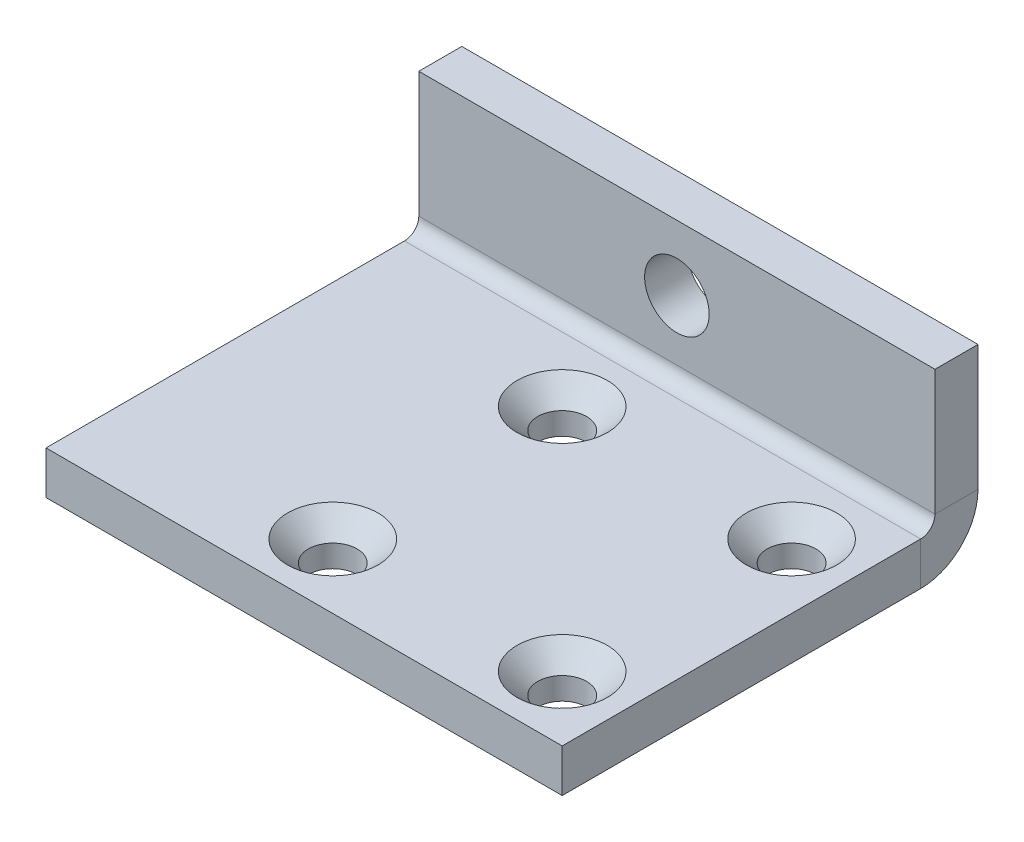
ISO-10303-21;
HEADER;
FILE_DESCRIPTION(('STEP AP214'),'2;1');
FILE_NAME('part.step','',(''),(''),'','','');
FILE_SCHEMA(('AUTOMOTIVE_DESIGN { 1 0 10303 214 1 1 1 1 }'));
ENDSEC;
DATA;
#1=APPLICATION_CONTEXT('core data for automotive mechanical design processes');
#2=APPLICATION_PROTOCOL_DEFINITION('international standard','automotive_design',2000,#1);
#3=PRODUCT_CONTEXT('',#1,'mechanical');
#4=PRODUCT('Part','Part','',(#3));
#5=PRODUCT_RELATED_PRODUCT_CATEGORY('part','',(#4));
#6=PRODUCT_DEFINITION_FORMATION('','',#4);
#7=PRODUCT_DEFINITION_CONTEXT('part definition',#1,'design');
#8=PRODUCT_DEFINITION('design','',#6,#7);
#9=PRODUCT_DEFINITION_SHAPE('','',#8);
#10=(LENGTH_UNIT() NAMED_UNIT(*) SI_UNIT(.MILLI.,.METRE.));
#11=(NAMED_UNIT(*) PLANE_ANGLE_UNIT() SI_UNIT($,.RADIAN.));
#12=(NAMED_UNIT(*) SI_UNIT($,.STERADIAN.) SOLID_ANGLE_UNIT());
#13=UNCERTAINTY_MEASURE_WITH_UNIT(LENGTH_MEASURE(1.E-05),#10,'distance_accuracy_value','');
#14=(GEOMETRIC_REPRESENTATION_CONTEXT(3) GLOBAL_UNCERTAINTY_ASSIGNED_CONTEXT((#13)) GLOBAL_UNIT_ASSIGNED_CONTEXT((#10,
#11,#12)) REPRESENTATION_CONTEXT('',''));
#15=CARTESIAN_POINT('',(0.,0.,0.));
#16=DIRECTION('',(0.,0.,1.));
#17=DIRECTION('',(1.,0.,0.));
#18=AXIS2_PLACEMENT_3D('',#15,#16,#17);
#19=CARTESIAN_POINT('',(36.,0.,3.99999999999999));
#20=DIRECTION('',(1.,0.,0.));
#21=DIRECTION('',(0.,0.,-1.));
#22=AXIS2_PLACEMENT_3D('',#19,#20,#21);
#23=PLANE('',#22);
#24=DIRECTION('',(0.,1.,0.));
#25=VECTOR('',#24,1.);
#26=CARTESIAN_POINT('',(36.,0.,3.99999999999999));
#27=LINE('',#26,#25);
#28=CARTESIAN_POINT('',(36.,0.,3.99999999999999));
#29=VERTEX_POINT('',#28);
#30=CARTESIAN_POINT('',(36.,3.,4.));
#31=VERTEX_POINT('',#30);
#32=EDGE_CURVE('E11',#29,#31,#27,.T.);
#33=ORIENTED_EDGE('',*,*,#32,.F.);
#34=CARTESIAN_POINT('',(36.,4.,4.));
#35=DIRECTION('',(-1.,0.,0.));
#36=DIRECTION('',(0.,0.,1.));
#37=AXIS2_PLACEMENT_3D('',#34,#35,#36);
#38=CIRCLE('',#37,4.);
#39=CARTESIAN_POINT('',(36.,4.,0.));
#40=VERTEX_POINT('',#39);
#41=EDGE_CURVE('E128',#29,#40,#38,.F.);
#42=ORIENTED_EDGE('',*,*,#41,.T.);
#43=DIRECTION('',(0.,0.,-1.));
#44=VECTOR('',#43,1.);
#45=CARTESIAN_POINT('',(36.,4.,3.));
#46=LINE('',#45,#44);
#47=CARTESIAN_POINT('',(36.,4.,3.));
#48=VERTEX_POINT('',#47);
#49=EDGE_CURVE('E46',#48,#40,#46,.T.);
#50=ORIENTED_EDGE('',*,*,#49,.F.);
#51=CARTESIAN_POINT('',(36.,4.,4.));
#52=DIRECTION('',(1.,0.,0.));
#53=DIRECTION('',(0.,0.,-1.));
#54=AXIS2_PLACEMENT_3D('',#51,#52,#53);
#55=CIRCLE('',#54,1.);
#56=EDGE_CURVE('E135',#31,#48,#55,.T.);
#57=ORIENTED_EDGE('',*,*,#56,.F.);
#58=EDGE_LOOP('',(#33,#42,#50,#57));
#59=FACE_BOUND('',#58,.T.);
#60=ADVANCED_FACE('F38',(#59),#23,.T.);
#61=CARTESIAN_POINT('',(36.,4.,3.));
#62=DIRECTION('',(1.,0.,0.));
#63=DIRECTION('',(0.,0.,-1.));
#64=AXIS2_PLACEMENT_3D('',#61,#62,#63);
#65=PLANE('',#64);
#66=DIRECTION('',(0.,0.,-1.));
#67=VECTOR('',#66,1.);
#68=CARTESIAN_POINT('',(36.,0.,0.));
#69=LINE('',#68,#67);
#70=CARTESIAN_POINT('',(36.,0.,29.));
#71=VERTEX_POINT('',#70);
#72=EDGE_CURVE('E123',#71,#29,#69,.T.);
#73=ORIENTED_EDGE('',*,*,#72,.T.);
#74=ORIENTED_EDGE('',*,*,#32,.T.);
#75=DIRECTION('',(0.,0.,-1.));
#76=VECTOR('',#75,1.);
#77=CARTESIAN_POINT('',(36.,3.,0.));
#78=LINE('',#77,#76);
#79=CARTESIAN_POINT('',(36.,3.,29.));
#80=VERTEX_POINT('',#79);
#81=EDGE_CURVE('E133',#80,#31,#78,.T.);
#82=ORIENTED_EDGE('',*,*,#81,.F.);
#83=DIRECTION('',(0.,1.,0.));
#84=VECTOR('',#83,1.);
#85=CARTESIAN_POINT('',(36.,0.,29.));
#86=LINE('',#85,#84);
#87=EDGE_CURVE('E114',#71,#80,#86,.T.);
#88=ORIENTED_EDGE('',*,*,#87,.F.);
#89=EDGE_LOOP('',(#73,#74,#82,#88));
#90=FACE_BOUND('',#89,.T.);
#91=ADVANCED_FACE('F131',(#90),#65,.T.);
#92=CARTESIAN_POINT('',(0.,4.,0.));
#93=DIRECTION('',(-1.,0.,0.));
#94=DIRECTION('',(0.,0.,1.));
#95=AXIS2_PLACEMENT_3D('',#92,#93,#94);
#96=PLANE('',#95);
#97=DIRECTION('',(0.,0.,1.));
#98=VECTOR('',#97,1.);
#99=CARTESIAN_POINT('',(0.,4.,0.));
#100=LINE('',#99,#98);
#101=CARTESIAN_POINT('',(0.,4.,0.));
#102=VERTEX_POINT('',#101);
#103=CARTESIAN_POINT('',(0.,4.,3.));
#104=VERTEX_POINT('',#103);
#105=EDGE_CURVE('E89',#102,#104,#100,.T.);
#106=ORIENTED_EDGE('',*,*,#105,.F.);
#107=CARTESIAN_POINT('',(0.,4.,4.));
#108=DIRECTION('',(-1.,0.,0.));
#109=DIRECTION('',(0.,0.,1.));
#110=AXIS2_PLACEMENT_3D('',#107,#108,#109);
#111=CIRCLE('',#110,4.);
#112=CARTESIAN_POINT('',(0.,0.,3.99999999999999));
#113=VERTEX_POINT('',#112);
#114=EDGE_CURVE('E158',#113,#102,#111,.F.);
#115=ORIENTED_EDGE('',*,*,#114,.F.);
#116=DIRECTION('',(0.,-1.,0.));
#117=VECTOR('',#116,1.);
#118=CARTESIAN_POINT('',(0.,3.,4.));
#119=LINE('',#118,#117);
#120=CARTESIAN_POINT('',(0.,3.,4.));
#121=VERTEX_POINT('',#120);
#122=EDGE_CURVE('E82',#121,#113,#119,.T.);
#123=ORIENTED_EDGE('',*,*,#122,.F.);
#124=CARTESIAN_POINT('',(0.,4.,4.));
#125=DIRECTION('',(1.,0.,0.));
#126=DIRECTION('',(0.,0.,-1.));
#127=AXIS2_PLACEMENT_3D('',#124,#125,#126);
#128=CIRCLE('',#127,1.);
#129=EDGE_CURVE('E151',#121,#104,#128,.T.);
#130=ORIENTED_EDGE('',*,*,#129,.T.);
#131=EDGE_LOOP('',(#106,#115,#123,#130));
#132=FACE_BOUND('',#131,.T.);
#133=ADVANCED_FACE('F190',(#132),#96,.T.);
#134=CARTESIAN_POINT('',(0.,3.,4.));
#135=DIRECTION('',(-1.,0.,0.));
#136=DIRECTION('',(0.,0.,1.));
#137=AXIS2_PLACEMENT_3D('',#134,#135,#136);
#138=PLANE('',#137);
#139=DIRECTION('',(0.,1.,0.));
#140=VECTOR('',#139,1.);
#141=CARTESIAN_POINT('',(0.,0.,0.));
#142=LINE('',#141,#140);
#143=CARTESIAN_POINT('',(0.,12.75,0.));
#144=VERTEX_POINT('',#143);
#145=EDGE_CURVE('E141',#102,#144,#142,.T.);
#146=ORIENTED_EDGE('',*,*,#145,.F.);
#147=ORIENTED_EDGE('',*,*,#105,.T.);
#148=DIRECTION('',(0.,1.,0.));
#149=VECTOR('',#148,1.);
#150=CARTESIAN_POINT('',(0.,0.,3.));
#151=LINE('',#150,#149);
#152=CARTESIAN_POINT('',(0.,12.75,3.));
#153=VERTEX_POINT('',#152);
#154=EDGE_CURVE('E148',#104,#153,#151,.T.);
#155=ORIENTED_EDGE('',*,*,#154,.T.);
#156=DIRECTION('',(0.,0.,-1.));
#157=VECTOR('',#156,1.);
#158=CARTESIAN_POINT('',(0.,12.75,3.));
#159=LINE('',#158,#157);
#160=EDGE_CURVE('E144',#153,#144,#159,.T.);
#161=ORIENTED_EDGE('',*,*,#160,.T.);
#162=EDGE_LOOP('',(#146,#147,#155,#161));
#163=FACE_BOUND('',#162,.T.);
#164=ADVANCED_FACE('F177',(#163),#138,.T.);
#165=CARTESIAN_POINT('',(36.,0.,0.));
#166=DIRECTION('',(0.,0.,1.));
#167=DIRECTION('',(1.,0.,0.));
#168=AXIS2_PLACEMENT_3D('',#165,#166,#167);
#169=PLANE('',#168);
#170=CARTESIAN_POINT('',(18.,8.2,0.));
#171=DIRECTION('',(0.,0.,1.));
#172=DIRECTION('',(1.,0.,0.));
#173=AXIS2_PLACEMENT_3D('',#170,#171,#172);
#174=CIRCLE('',#173,2.25);
#175=CARTESIAN_POINT('',(20.25,8.2,0.));
#176=VERTEX_POINT('',#175);
#177=EDGE_CURVE('E237',#176,#176,#174,.T.);
#178=ORIENTED_EDGE('',*,*,#177,.T.);
#179=EDGE_LOOP('',(#178));
#180=FACE_BOUND('',#179,.T.);
#181=ORIENTED_EDGE('',*,*,#145,.T.);
#182=DIRECTION('',(-1.,0.,0.));
#183=VECTOR('',#182,1.);
#184=CARTESIAN_POINT('',(36.,12.75,0.));
#185=LINE('',#184,#183);
#186=CARTESIAN_POINT('',(36.,12.75,0.));
#187=VERTEX_POINT('',#186);
#188=EDGE_CURVE('E172',#187,#144,#185,.T.);
#189=ORIENTED_EDGE('',*,*,#188,.F.);
#190=DIRECTION('',(0.,1.,0.));
#191=VECTOR('',#190,1.);
#192=CARTESIAN_POINT('',(36.,0.,0.));
#193=LINE('',#192,#191);
#194=EDGE_CURVE('E95',#40,#187,#193,.T.);
#195=ORIENTED_EDGE('',*,*,#194,.F.);
#196=DIRECTION('',(-1.,0.,0.));
#197=VECTOR('',#196,1.);
#198=CARTESIAN_POINT('',(36.,4.,0.));
#199=LINE('',#198,#197);
#200=EDGE_CURVE('E140',#40,#102,#199,.T.);
#201=ORIENTED_EDGE('',*,*,#200,.T.);
#202=EDGE_LOOP('',(#181,#189,#195,#201));
#203=FACE_BOUND('',#202,.T.);
#204=ADVANCED_FACE('F254',(#180,#203),#169,.F.);
#205=CARTESIAN_POINT('',(36.,12.75,3.));
#206=DIRECTION('',(0.,1.,0.));
#207=DIRECTION('',(0.,0.,1.));
#208=AXIS2_PLACEMENT_3D('',#205,#206,#207);
#209=PLANE('',#208);
#210=ORIENTED_EDGE('',*,*,#160,.F.);
#211=DIRECTION('',(-1.,0.,0.));
#212=VECTOR('',#211,1.);
#213=CARTESIAN_POINT('',(36.,12.75,3.));
#214=LINE('',#213,#212);
#215=CARTESIAN_POINT('',(36.,12.75,3.));
#216=VERTEX_POINT('',#215);
#217=EDGE_CURVE('E170',#216,#153,#214,.T.);
#218=ORIENTED_EDGE('',*,*,#217,.F.);
#219=DIRECTION('',(0.,0.,-1.));
#220=VECTOR('',#219,1.);
#221=CARTESIAN_POINT('',(36.,12.75,3.));
#222=LINE('',#221,#220);
#223=EDGE_CURVE('E196',#216,#187,#222,.T.);
#224=ORIENTED_EDGE('',*,*,#223,.T.);
#225=ORIENTED_EDGE('',*,*,#188,.T.);
#226=EDGE_LOOP('',(#210,#218,#224,#225));
#227=FACE_BOUND('',#226,.T.);
#228=ADVANCED_FACE('F247',(#227),#209,.T.);
#229=CARTESIAN_POINT('',(36.,0.,3.));
#230=DIRECTION('',(0.,0.,1.));
#231=DIRECTION('',(1.,0.,0.));
#232=AXIS2_PLACEMENT_3D('',#229,#230,#231);
#233=PLANE('',#232);
#234=CARTESIAN_POINT('',(18.,8.2,3.));
#235=DIRECTION('',(0.,0.,1.));
#236=DIRECTION('',(1.,0.,0.));
#237=AXIS2_PLACEMENT_3D('',#234,#235,#236);
#238=CIRCLE('',#237,2.25);
#239=CARTESIAN_POINT('',(20.25,8.2,3.));
#240=VERTEX_POINT('',#239);
#241=EDGE_CURVE('E240',#240,#240,#238,.T.);
#242=ORIENTED_EDGE('',*,*,#241,.F.);
#243=EDGE_LOOP('',(#242));
#244=FACE_BOUND('',#243,.T.);
#245=ORIENTED_EDGE('',*,*,#154,.F.);
#246=DIRECTION('',(-1.,0.,0.));
#247=VECTOR('',#246,1.);
#248=CARTESIAN_POINT('',(36.,4.,3.));
#249=LINE('',#248,#247);
#250=EDGE_CURVE('E167',#48,#104,#249,.T.);
#251=ORIENTED_EDGE('',*,*,#250,.F.);
#252=DIRECTION('',(0.,1.,0.));
#253=VECTOR('',#252,1.);
#254=CARTESIAN_POINT('',(36.,0.,3.));
#255=LINE('',#254,#253);
#256=EDGE_CURVE('E195',#48,#216,#255,.T.);
#257=ORIENTED_EDGE('',*,*,#256,.T.);
#258=ORIENTED_EDGE('',*,*,#217,.T.);
#259=EDGE_LOOP('',(#245,#251,#257,#258));
#260=FACE_BOUND('',#259,.T.);
#261=ADVANCED_FACE('F188',(#244,#260),#233,.T.);
#262=CARTESIAN_POINT('',(36.,4.,4.));
#263=DIRECTION('',(-1.,0.,0.));
#264=DIRECTION('',(0.,0.,1.));
#265=AXIS2_PLACEMENT_3D('',#262,#263,#264);
#266=CYLINDRICAL_SURFACE('',#265,1.);
#267=ORIENTED_EDGE('',*,*,#129,.F.);
#268=DIRECTION('',(-1.,0.,0.));
#269=VECTOR('',#268,1.);
#270=CARTESIAN_POINT('',(36.,3.,4.));
#271=LINE('',#270,#269);
#272=EDGE_CURVE('E164',#31,#121,#271,.T.);
#273=ORIENTED_EDGE('',*,*,#272,.F.);
#274=ORIENTED_EDGE('',*,*,#56,.T.);
#275=ORIENTED_EDGE('',*,*,#250,.T.);
#276=EDGE_LOOP('',(#267,#273,#274,#275));
#277=FACE_BOUND('',#276,.T.);
#278=ADVANCED_FACE('F183',(#277),#266,.F.);
#279=CARTESIAN_POINT('',(36.,3.,0.));
#280=DIRECTION('',(0.,1.,0.));
#281=DIRECTION('',(0.,0.,1.));
#282=AXIS2_PLACEMENT_3D('',#279,#280,#281);
#283=PLANE('',#282);
#284=CARTESIAN_POINT('',(15.5,3.,24.5));
#285=DIRECTION('',(0.,1.,0.));
#286=DIRECTION('',(0.,0.,1.));
#287=AXIS2_PLACEMENT_3D('',#284,#285,#286);
#288=CIRCLE('',#287,3.15);
#289=CARTESIAN_POINT('',(15.5,3.,27.65));
#290=VERTEX_POINT('',#289);
#291=EDGE_CURVE('E234',#290,#290,#288,.T.);
#292=ORIENTED_EDGE('',*,*,#291,.F.);
#293=EDGE_LOOP('',(#292));
#294=FACE_BOUND('',#293,.T.);
#295=CARTESIAN_POINT('',(15.5,3.,8.5));
#296=DIRECTION('',(0.,1.,0.));
#297=DIRECTION('',(0.,0.,1.));
#298=AXIS2_PLACEMENT_3D('',#295,#296,#297);
#299=CIRCLE('',#298,3.15);
#300=CARTESIAN_POINT('',(15.5,3.,11.65));
#301=VERTEX_POINT('',#300);
#302=EDGE_CURVE('E225',#301,#301,#299,.T.);
#303=ORIENTED_EDGE('',*,*,#302,.F.);
#304=EDGE_LOOP('',(#303));
#305=FACE_BOUND('',#304,.T.);
#306=CARTESIAN_POINT('',(31.5,3.,8.5));
#307=DIRECTION('',(0.,1.,0.));
#308=DIRECTION('',(0.,0.,1.));
#309=AXIS2_PLACEMENT_3D('',#306,#307,#308);
#310=CIRCLE('',#309,3.15);
#311=CARTESIAN_POINT('',(31.5,3.,11.65));
#312=VERTEX_POINT('',#311);
#313=EDGE_CURVE('E216',#312,#312,#310,.T.);
#314=ORIENTED_EDGE('',*,*,#313,.F.);
#315=EDGE_LOOP('',(#314));
#316=FACE_BOUND('',#315,.T.);
#317=CARTESIAN_POINT('',(31.5,3.,24.5));
#318=DIRECTION('',(0.,1.,0.));
#319=DIRECTION('',(0.,0.,1.));
#320=AXIS2_PLACEMENT_3D('',#317,#318,#319);
#321=CIRCLE('',#320,3.15);
#322=CARTESIAN_POINT('',(31.5,3.,27.65));
#323=VERTEX_POINT('',#322);
#324=EDGE_CURVE('E207',#323,#323,#321,.T.);
#325=ORIENTED_EDGE('',*,*,#324,.F.);
#326=EDGE_LOOP('',(#325));
#327=FACE_BOUND('',#326,.T.);
#328=DIRECTION('',(0.,0.,-1.));
#329=VECTOR('',#328,1.);
#330=CARTESIAN_POINT('',(0.,3.,0.));
#331=LINE('',#330,#329);
#332=CARTESIAN_POINT('',(0.,3.,29.));
#333=VERTEX_POINT('',#332);
#334=EDGE_CURVE('E153',#333,#121,#331,.T.);
#335=ORIENTED_EDGE('',*,*,#334,.F.);
#336=DIRECTION('',(-1.,0.,0.));
#337=VECTOR('',#336,1.);
#338=CARTESIAN_POINT('',(36.,3.,29.));
#339=LINE('',#338,#337);
#340=EDGE_CURVE('E118',#80,#333,#339,.T.);
#341=ORIENTED_EDGE('',*,*,#340,.F.);
#342=ORIENTED_EDGE('',*,*,#81,.T.);
#343=ORIENTED_EDGE('',*,*,#272,.T.);
#344=EDGE_LOOP('',(#335,#341,#342,#343));
#345=FACE_BOUND('',#344,.T.);
#346=ADVANCED_FACE('F193',(#294,#305,#316,#327,#345),#283,.T.);
#347=CARTESIAN_POINT('',(36.,0.,29.));
#348=DIRECTION('',(0.,0.,1.));
#349=DIRECTION('',(1.,0.,0.));
#350=AXIS2_PLACEMENT_3D('',#347,#348,#349);
#351=PLANE('',#350);
#352=DIRECTION('',(0.,1.,0.));
#353=VECTOR('',#352,1.);
#354=CARTESIAN_POINT('',(0.,0.,29.));
#355=LINE('',#354,#353);
#356=CARTESIAN_POINT('',(0.,0.,29.));
#357=VERTEX_POINT('',#356);
#358=EDGE_CURVE('E116',#357,#333,#355,.T.);
#359=ORIENTED_EDGE('',*,*,#358,.F.);
#360=DIRECTION('',(-1.,0.,0.));
#361=VECTOR('',#360,1.);
#362=CARTESIAN_POINT('',(36.,0.,29.));
#363=LINE('',#362,#361);
#364=EDGE_CURVE('E110',#71,#357,#363,.T.);
#365=ORIENTED_EDGE('',*,*,#364,.F.);
#366=ORIENTED_EDGE('',*,*,#87,.T.);
#367=ORIENTED_EDGE('',*,*,#340,.T.);
#368=EDGE_LOOP('',(#359,#365,#366,#367));
#369=FACE_BOUND('',#368,.T.);
#370=ADVANCED_FACE('F112',(#369),#351,.T.);
#371=CARTESIAN_POINT('',(36.,0.,0.));
#372=DIRECTION('',(0.,1.,0.));
#373=DIRECTION('',(0.,0.,1.));
#374=AXIS2_PLACEMENT_3D('',#371,#372,#373);
#375=PLANE('',#374);
#376=CARTESIAN_POINT('',(15.5,0.,24.5));
#377=DIRECTION('',(0.,1.,0.));
#378=DIRECTION('',(0.,0.,1.));
#379=AXIS2_PLACEMENT_3D('',#376,#377,#378);
#380=CIRCLE('',#379,1.69999999999999);
#381=CARTESIAN_POINT('',(15.5,0.,26.2));
#382=VERTEX_POINT('',#381);
#383=EDGE_CURVE('E228',#382,#382,#380,.T.);
#384=ORIENTED_EDGE('',*,*,#383,.T.);
#385=EDGE_LOOP('',(#384));
#386=FACE_BOUND('',#385,.T.);
#387=CARTESIAN_POINT('',(15.5,0.,8.5));
#388=DIRECTION('',(0.,1.,0.));
#389=DIRECTION('',(0.,0.,1.));
#390=AXIS2_PLACEMENT_3D('',#387,#388,#389);
#391=CIRCLE('',#390,1.69999999999999);
#392=CARTESIAN_POINT('',(15.5,0.,10.2));
#393=VERTEX_POINT('',#392);
#394=EDGE_CURVE('E219',#393,#393,#391,.T.);
#395=ORIENTED_EDGE('',*,*,#394,.T.);
#396=EDGE_LOOP('',(#395));
#397=FACE_BOUND('',#396,.T.);
#398=CARTESIAN_POINT('',(31.5,0.,8.5));
#399=DIRECTION('',(0.,1.,0.));
#400=DIRECTION('',(0.,0.,1.));
#401=AXIS2_PLACEMENT_3D('',#398,#399,#400);
#402=CIRCLE('',#401,1.69999999999999);
#403=CARTESIAN_POINT('',(31.5,0.,10.2));
#404=VERTEX_POINT('',#403);
#405=EDGE_CURVE('E210',#404,#404,#402,.T.);
#406=ORIENTED_EDGE('',*,*,#405,.T.);
#407=EDGE_LOOP('',(#406));
#408=FACE_BOUND('',#407,.T.);
#409=CARTESIAN_POINT('',(31.5,0.,24.5));
#410=DIRECTION('',(0.,1.,0.));
#411=DIRECTION('',(0.,0.,1.));
#412=AXIS2_PLACEMENT_3D('',#409,#410,#411);
#413=CIRCLE('',#412,1.69999999999999);
#414=CARTESIAN_POINT('',(31.5,0.,26.2));
#415=VERTEX_POINT('',#414);
#416=EDGE_CURVE('E145',#415,#415,#413,.T.);
#417=ORIENTED_EDGE('',*,*,#416,.T.);
#418=EDGE_LOOP('',(#417));
#419=FACE_BOUND('',#418,.T.);
#420=DIRECTION('',(0.,0.,-1.));
#421=VECTOR('',#420,1.);
#422=CARTESIAN_POINT('',(0.,0.,0.));
#423=LINE('',#422,#421);
#424=EDGE_CURVE('E156',#357,#113,#423,.T.);
#425=ORIENTED_EDGE('',*,*,#424,.T.);
#426=DIRECTION('',(-1.,0.,0.));
#427=VECTOR('',#426,1.);
#428=CARTESIAN_POINT('',(36.,0.,3.99999999999999));
#429=LINE('',#428,#427);
#430=EDGE_CURVE('E119',#29,#113,#429,.T.);
#431=ORIENTED_EDGE('',*,*,#430,.F.);
#432=ORIENTED_EDGE('',*,*,#72,.F.);
#433=ORIENTED_EDGE('',*,*,#364,.T.);
#434=EDGE_LOOP('',(#425,#431,#432,#433));
#435=FACE_BOUND('',#434,.T.);
#436=ADVANCED_FACE('F124',(#386,#397,#408,#419,#435),#375,.F.);
#437=CARTESIAN_POINT('',(36.,4.,4.));
#438=DIRECTION('',(-1.,0.,0.));
#439=DIRECTION('',(0.,0.,1.));
#440=AXIS2_PLACEMENT_3D('',#437,#438,#439);
#441=CYLINDRICAL_SURFACE('',#440,4.);
#442=ORIENTED_EDGE('',*,*,#114,.T.);
#443=ORIENTED_EDGE('',*,*,#200,.F.);
#444=ORIENTED_EDGE('',*,*,#41,.F.);
#445=ORIENTED_EDGE('',*,*,#430,.T.);
#446=EDGE_LOOP('',(#442,#443,#444,#445));
#447=FACE_BOUND('',#446,.T.);
#448=ADVANCED_FACE('F278',(#447),#441,.T.);
#449=CARTESIAN_POINT('',(36.,4.,4.));
#450=DIRECTION('',(1.,0.,0.));
#451=DIRECTION('',(0.,0.,-1.));
#452=AXIS2_PLACEMENT_3D('',#449,#450,#451);
#453=PLANE('',#452);
#454=ORIENTED_EDGE('',*,*,#194,.T.);
#455=ORIENTED_EDGE('',*,*,#223,.F.);
#456=ORIENTED_EDGE('',*,*,#256,.F.);
#457=ORIENTED_EDGE('',*,*,#49,.T.);
#458=EDGE_LOOP('',(#454,#455,#456,#457));
#459=FACE_BOUND('',#458,.T.);
#460=ADVANCED_FACE('F275',(#459),#453,.T.);
#461=CARTESIAN_POINT('',(0.,4.,4.));
#462=DIRECTION('',(1.,0.,0.));
#463=DIRECTION('',(0.,0.,-1.));
#464=AXIS2_PLACEMENT_3D('',#461,#462,#463);
#465=PLANE('',#464);
#466=ORIENTED_EDGE('',*,*,#334,.T.);
#467=ORIENTED_EDGE('',*,*,#122,.T.);
#468=ORIENTED_EDGE('',*,*,#424,.F.);
#469=ORIENTED_EDGE('',*,*,#358,.T.);
#470=EDGE_LOOP('',(#466,#467,#468,#469));
#471=FACE_BOUND('',#470,.T.);
#472=ADVANCED_FACE('F277',(#471),#465,.F.);
#473=CARTESIAN_POINT('',(31.5,3.,24.5));
#474=DIRECTION('',(0.,1.,0.));
#475=DIRECTION('',(0.,0.,1.));
#476=AXIS2_PLACEMENT_3D('',#473,#474,#475);
#477=CYLINDRICAL_SURFACE('',#476,1.69999999999999);
#478=ORIENTED_EDGE('',*,*,#416,.F.);
#479=EDGE_LOOP('',(#478));
#480=FACE_BOUND('',#479,.T.);
#481=CARTESIAN_POINT('',(31.5,1.54999999999999,24.5));
#482=DIRECTION('',(0.,1.,0.));
#483=DIRECTION('',(0.,0.,1.));
#484=AXIS2_PLACEMENT_3D('',#481,#482,#483);
#485=CIRCLE('',#484,1.69999999999999);
#486=CARTESIAN_POINT('',(31.5,1.54999999999999,26.2));
#487=VERTEX_POINT('',#486);
#488=EDGE_CURVE('E204',#487,#487,#485,.T.);
#489=ORIENTED_EDGE('',*,*,#488,.T.);
#490=EDGE_LOOP('',(#489));
#491=FACE_BOUND('',#490,.T.);
#492=ADVANCED_FACE('F284',(#480,#491),#477,.F.);
#493=CARTESIAN_POINT('',(31.5,3.,24.5));
#494=DIRECTION('',(0.,1.,0.));
#495=DIRECTION('',(0.,0.,1.));
#496=AXIS2_PLACEMENT_3D('',#493,#494,#495);
#497=CONICAL_SURFACE('',#496,3.15,0.78539816339745);
#498=ORIENTED_EDGE('',*,*,#488,.F.);
#499=EDGE_LOOP('',(#498));
#500=FACE_BOUND('',#499,.T.);
#501=ORIENTED_EDGE('',*,*,#324,.T.);
#502=EDGE_LOOP('',(#501));
#503=FACE_BOUND('',#502,.T.);
#504=ADVANCED_FACE('F308',(#500,#503),#497,.F.);
#505=CARTESIAN_POINT('',(31.5,3.,8.5));
#506=DIRECTION('',(0.,1.,0.));
#507=DIRECTION('',(0.,0.,1.));
#508=AXIS2_PLACEMENT_3D('',#505,#506,#507);
#509=CYLINDRICAL_SURFACE('',#508,1.69999999999999);
#510=ORIENTED_EDGE('',*,*,#405,.F.);
#511=EDGE_LOOP('',(#510));
#512=FACE_BOUND('',#511,.T.);
#513=CARTESIAN_POINT('',(31.5,1.54999999999999,8.5));
#514=DIRECTION('',(0.,1.,0.));
#515=DIRECTION('',(0.,0.,1.));
#516=AXIS2_PLACEMENT_3D('',#513,#514,#515);
#517=CIRCLE('',#516,1.69999999999999);
#518=CARTESIAN_POINT('',(31.5,1.54999999999999,10.2));
#519=VERTEX_POINT('',#518);
#520=EDGE_CURVE('E213',#519,#519,#517,.T.);
#521=ORIENTED_EDGE('',*,*,#520,.T.);
#522=EDGE_LOOP('',(#521));
#523=FACE_BOUND('',#522,.T.);
#524=ADVANCED_FACE('F310',(#512,#523),#509,.F.);
#525=CARTESIAN_POINT('',(31.5,3.,8.5));
#526=DIRECTION('',(0.,1.,0.));
#527=DIRECTION('',(0.,0.,1.));
#528=AXIS2_PLACEMENT_3D('',#525,#526,#527);
#529=CONICAL_SURFACE('',#528,3.15,0.78539816339745);
#530=ORIENTED_EDGE('',*,*,#520,.F.);
#531=EDGE_LOOP('',(#530));
#532=FACE_BOUND('',#531,.T.);
#533=ORIENTED_EDGE('',*,*,#313,.T.);
#534=EDGE_LOOP('',(#533));
#535=FACE_BOUND('',#534,.T.);
#536=ADVANCED_FACE('F316',(#532,#535),#529,.F.);
#537=CARTESIAN_POINT('',(15.5,3.,8.5));
#538=DIRECTION('',(0.,1.,0.));
#539=DIRECTION('',(0.,0.,1.));
#540=AXIS2_PLACEMENT_3D('',#537,#538,#539);
#541=CYLINDRICAL_SURFACE('',#540,1.69999999999999);
#542=ORIENTED_EDGE('',*,*,#394,.F.);
#543=EDGE_LOOP('',(#542));
#544=FACE_BOUND('',#543,.T.);
#545=CARTESIAN_POINT('',(15.5,1.54999999999999,8.5));
#546=DIRECTION('',(0.,1.,0.));
#547=DIRECTION('',(0.,0.,1.));
#548=AXIS2_PLACEMENT_3D('',#545,#546,#547);
#549=CIRCLE('',#548,1.69999999999999);
#550=CARTESIAN_POINT('',(15.5,1.54999999999999,10.2));
#551=VERTEX_POINT('',#550);
#552=EDGE_CURVE('E222',#551,#551,#549,.T.);
#553=ORIENTED_EDGE('',*,*,#552,.T.);
#554=EDGE_LOOP('',(#553));
#555=FACE_BOUND('',#554,.T.);
#556=ADVANCED_FACE('F324',(#544,#555),#541,.F.);
#557=CARTESIAN_POINT('',(15.5,3.,8.5));
#558=DIRECTION('',(0.,1.,0.));
#559=DIRECTION('',(0.,0.,1.));
#560=AXIS2_PLACEMENT_3D('',#557,#558,#559);
#561=CONICAL_SURFACE('',#560,3.15,0.78539816339745);
#562=ORIENTED_EDGE('',*,*,#552,.F.);
#563=EDGE_LOOP('',(#562));
#564=FACE_BOUND('',#563,.T.);
#565=ORIENTED_EDGE('',*,*,#302,.T.);
#566=EDGE_LOOP('',(#565));
#567=FACE_BOUND('',#566,.T.);
#568=ADVANCED_FACE('F328',(#564,#567),#561,.F.);
#569=CARTESIAN_POINT('',(15.5,3.,24.5));
#570=DIRECTION('',(0.,1.,0.));
#571=DIRECTION('',(0.,0.,1.));
#572=AXIS2_PLACEMENT_3D('',#569,#570,#571);
#573=CYLINDRICAL_SURFACE('',#572,1.69999999999999);
#574=ORIENTED_EDGE('',*,*,#383,.F.);
#575=EDGE_LOOP('',(#574));
#576=FACE_BOUND('',#575,.T.);
#577=CARTESIAN_POINT('',(15.5,1.54999999999999,24.5));
#578=DIRECTION('',(0.,1.,0.));
#579=DIRECTION('',(0.,0.,1.));
#580=AXIS2_PLACEMENT_3D('',#577,#578,#579);
#581=CIRCLE('',#580,1.69999999999999);
#582=CARTESIAN_POINT('',(15.5,1.54999999999999,26.2));
#583=VERTEX_POINT('',#582);
#584=EDGE_CURVE('E231',#583,#583,#581,.T.);
#585=ORIENTED_EDGE('',*,*,#584,.T.);
#586=EDGE_LOOP('',(#585));
#587=FACE_BOUND('',#586,.T.);
#588=ADVANCED_FACE('F332',(#576,#587),#573,.F.);
#589=CARTESIAN_POINT('',(15.5,3.,24.5));
#590=DIRECTION('',(0.,1.,0.));
#591=DIRECTION('',(0.,0.,1.));
#592=AXIS2_PLACEMENT_3D('',#589,#590,#591);
#593=CONICAL_SURFACE('',#592,3.15,0.78539816339745);
#594=ORIENTED_EDGE('',*,*,#584,.F.);
#595=EDGE_LOOP('',(#594));
#596=FACE_BOUND('',#595,.T.);
#597=ORIENTED_EDGE('',*,*,#291,.T.);
#598=EDGE_LOOP('',(#597));
#599=FACE_BOUND('',#598,.T.);
#600=ADVANCED_FACE('F336',(#596,#599),#593,.F.);
#601=CARTESIAN_POINT('',(18.,8.2,3.));
#602=DIRECTION('',(0.,0.,1.));
#603=DIRECTION('',(1.,0.,0.));
#604=AXIS2_PLACEMENT_3D('',#601,#602,#603);
#605=CYLINDRICAL_SURFACE('',#604,2.25);
#606=ORIENTED_EDGE('',*,*,#177,.F.);
#607=EDGE_LOOP('',(#606));
#608=FACE_BOUND('',#607,.T.);
#609=ORIENTED_EDGE('',*,*,#241,.T.);
#610=EDGE_LOOP('',(#609));
#611=FACE_BOUND('',#610,.T.);
#612=ADVANCED_FACE('F244',(#608,#611),#605,.F.);
#613=CLOSED_SHELL('',(#60,#91,#133,#164,#204,#228,#261,#278,#346,#370,#436,#448,#460,#472,#492,
#504,#524,#536,#556,#568,#588,#600,#612));
#614=MANIFOLD_SOLID_BREP('B2',#613);
#615=ADVANCED_BREP_SHAPE_REPRESENTATION('',(#18,#614),#14);
#616=SHAPE_DEFINITION_REPRESENTATION(#9,#615);
ENDSEC;
END-ISO-10303-21;
